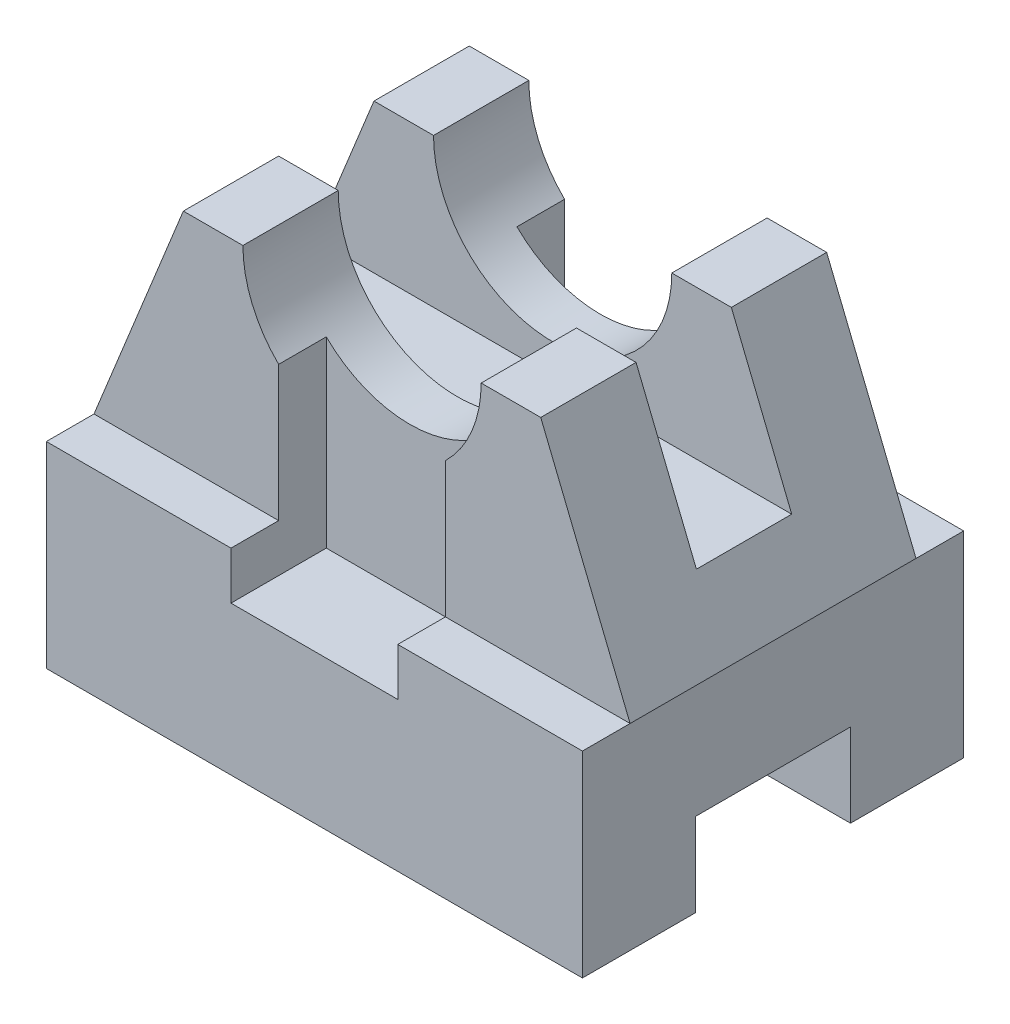
ISO-10303-21;
HEADER;
FILE_DESCRIPTION(('STEP AP214'),'2;1');
FILE_NAME('part.step','',(''),(''),'','','');
FILE_SCHEMA(('AUTOMOTIVE_DESIGN { 1 0 10303 214 1 1 1 1 }'));
ENDSEC;
DATA;
#1=APPLICATION_CONTEXT('core data for automotive mechanical design processes');
#2=APPLICATION_PROTOCOL_DEFINITION('international standard','automotive_design',2000,#1);
#3=PRODUCT_CONTEXT('',#1,'mechanical');
#4=PRODUCT('Part','Part','',(#3));
#5=PRODUCT_RELATED_PRODUCT_CATEGORY('part','',(#4));
#6=PRODUCT_DEFINITION_FORMATION('','',#4);
#7=PRODUCT_DEFINITION_CONTEXT('part definition',#1,'design');
#8=PRODUCT_DEFINITION('design','',#6,#7);
#9=PRODUCT_DEFINITION_SHAPE('','',#8);
#10=(LENGTH_UNIT() NAMED_UNIT(*) SI_UNIT(.MILLI.,.METRE.));
#11=(NAMED_UNIT(*) PLANE_ANGLE_UNIT() SI_UNIT($,.RADIAN.));
#12=(NAMED_UNIT(*) SI_UNIT($,.STERADIAN.) SOLID_ANGLE_UNIT());
#13=UNCERTAINTY_MEASURE_WITH_UNIT(LENGTH_MEASURE(1.E-05),#10,'distance_accuracy_value','');
#14=(GEOMETRIC_REPRESENTATION_CONTEXT(3) GLOBAL_UNCERTAINTY_ASSIGNED_CONTEXT((#13)) GLOBAL_UNIT_ASSIGNED_CONTEXT((#10,
#11,#12)) REPRESENTATION_CONTEXT('',''));
#15=CARTESIAN_POINT('',(0.,0.,0.));
#16=DIRECTION('',(0.,0.,1.));
#17=DIRECTION('',(1.,0.,0.));
#18=AXIS2_PLACEMENT_3D('',#15,#16,#17);
#19=CARTESIAN_POINT('',(0.,0.,0.));
#20=DIRECTION('',(0.,1.,0.));
#21=DIRECTION('',(0.,0.,1.));
#22=AXIS2_PLACEMENT_3D('',#19,#20,#21);
#23=PLANE('',#22);
#24=DIRECTION('',(0.,0.,-1.));
#25=VECTOR('',#24,1.);
#26=CARTESIAN_POINT('',(45.,0.,-32.));
#27=LINE('',#26,#25);
#28=CARTESIAN_POINT('',(45.,0.,-13.));
#29=VERTEX_POINT('',#28);
#30=CARTESIAN_POINT('',(45.,0.,-32.));
#31=VERTEX_POINT('',#30);
#32=EDGE_CURVE('E404',#29,#31,#27,.T.);
#33=ORIENTED_EDGE('',*,*,#32,.F.);
#34=DIRECTION('',(1.,0.,0.));
#35=VECTOR('',#34,1.);
#36=CARTESIAN_POINT('',(-45.,0.,-13.));
#37=LINE('',#36,#35);
#38=CARTESIAN_POINT('',(-45.,0.,-13.));
#39=VERTEX_POINT('',#38);
#40=EDGE_CURVE('E262',#39,#29,#37,.T.);
#41=ORIENTED_EDGE('',*,*,#40,.F.);
#42=DIRECTION('',(0.,0.,1.));
#43=VECTOR('',#42,1.);
#44=CARTESIAN_POINT('',(-45.,0.,-32.));
#45=LINE('',#44,#43);
#46=CARTESIAN_POINT('',(-45.,0.,-32.));
#47=VERTEX_POINT('',#46);
#48=EDGE_CURVE('E443',#47,#39,#45,.T.);
#49=ORIENTED_EDGE('',*,*,#48,.F.);
#50=DIRECTION('',(-1.,0.,0.));
#51=VECTOR('',#50,1.);
#52=CARTESIAN_POINT('',(-45.,0.,-32.));
#53=LINE('',#52,#51);
#54=EDGE_CURVE('E440',#31,#47,#53,.T.);
#55=ORIENTED_EDGE('',*,*,#54,.F.);
#56=EDGE_LOOP('',(#33,#41,#49,#55));
#57=FACE_BOUND('',#56,.T.);
#58=ADVANCED_FACE('F37',(#57),#23,.F.);
#59=CARTESIAN_POINT('',(0.,70.,-24.));
#60=DIRECTION('',(0.,0.,1.));
#61=DIRECTION('',(1.,0.,0.));
#62=AXIS2_PLACEMENT_3D('',#59,#60,#61);
#63=CYLINDRICAL_SURFACE('',#62,20.);
#64=CARTESIAN_POINT('',(0.,70.,16.));
#65=DIRECTION('',(0.,0.,1.));
#66=DIRECTION('',(1.,0.,0.));
#67=AXIS2_PLACEMENT_3D('',#64,#65,#66);
#68=CIRCLE('',#67,20.);
#69=CARTESIAN_POINT('',(-14.,55.7171431429143,16.));
#70=VERTEX_POINT('',#69);
#71=CARTESIAN_POINT('',(14.,55.7171431429143,16.));
#72=VERTEX_POINT('',#71);
#73=EDGE_CURVE('E11',#70,#72,#68,.T.);
#74=ORIENTED_EDGE('',*,*,#73,.T.);
#75=DIRECTION('',(0.,0.,1.));
#76=VECTOR('',#75,1.);
#77=CARTESIAN_POINT('',(14.,55.7171431429143,-24.));
#78=LINE('',#77,#76);
#79=CARTESIAN_POINT('',(14.,55.7171431429143,24.));
#80=VERTEX_POINT('',#79);
#81=EDGE_CURVE('E302',#72,#80,#78,.T.);
#82=ORIENTED_EDGE('',*,*,#81,.T.);
#83=CARTESIAN_POINT('',(0.,70.,24.));
#84=DIRECTION('',(0.,0.,-1.));
#85=DIRECTION('',(1.,0.,0.));
#86=AXIS2_PLACEMENT_3D('',#83,#84,#85);
#87=CIRCLE('',#86,20.);
#88=CARTESIAN_POINT('',(20.,70.,24.));
#89=VERTEX_POINT('',#88);
#90=EDGE_CURVE('E368',#89,#80,#87,.T.);
#91=ORIENTED_EDGE('',*,*,#90,.F.);
#92=DIRECTION('',(0.,0.,1.));
#93=VECTOR('',#92,1.);
#94=CARTESIAN_POINT('',(20.,70.,-24.));
#95=LINE('',#94,#93);
#96=CARTESIAN_POINT('',(20.,70.,8.));
#97=VERTEX_POINT('',#96);
#98=EDGE_CURVE('E418',#97,#89,#95,.T.);
#99=ORIENTED_EDGE('',*,*,#98,.F.);
#100=CARTESIAN_POINT('',(0.,70.,8.));
#101=DIRECTION('',(0.,0.,1.));
#102=DIRECTION('',(1.,0.,0.));
#103=AXIS2_PLACEMENT_3D('',#100,#101,#102);
#104=CIRCLE('',#103,20.);
#105=CARTESIAN_POINT('',(-20.,70.,8.));
#106=VERTEX_POINT('',#105);
#107=EDGE_CURVE('E352',#106,#97,#104,.T.);
#108=ORIENTED_EDGE('',*,*,#107,.F.);
#109=DIRECTION('',(0.,0.,1.));
#110=VECTOR('',#109,1.);
#111=CARTESIAN_POINT('',(-20.,70.,-24.));
#112=LINE('',#111,#110);
#113=CARTESIAN_POINT('',(-20.,70.,24.));
#114=VERTEX_POINT('',#113);
#115=EDGE_CURVE('E414',#106,#114,#112,.T.);
#116=ORIENTED_EDGE('',*,*,#115,.T.);
#117=CARTESIAN_POINT('',(-14.,55.7171431429143,24.));
#118=VERTEX_POINT('',#117);
#119=EDGE_CURVE('E367',#118,#114,#87,.T.);
#120=ORIENTED_EDGE('',*,*,#119,.F.);
#121=DIRECTION('',(0.,0.,1.));
#122=VECTOR('',#121,1.);
#123=CARTESIAN_POINT('',(-14.,55.7171431429143,-24.));
#124=LINE('',#123,#122);
#125=EDGE_CURVE('E60',#118,#70,#124,.F.);
#126=ORIENTED_EDGE('',*,*,#125,.T.);
#127=EDGE_LOOP('',(#74,#82,#91,#99,#108,#116,#120,#126));
#128=FACE_BOUND('',#127,.T.);
#129=ADVANCED_FACE('F498',(#128),#63,.F.);
#130=CARTESIAN_POINT('',(-45.,33.,32.));
#131=DIRECTION('',(0.,0.,-1.));
#132=DIRECTION('',(-1.,0.,0.));
#133=AXIS2_PLACEMENT_3D('',#130,#131,#132);
#134=PLANE('',#133);
#135=DIRECTION('',(0.,1.,0.));
#136=VECTOR('',#135,1.);
#137=CARTESIAN_POINT('',(14.,25.,32.));
#138=LINE('',#137,#136);
#139=CARTESIAN_POINT('',(14.,25.,32.));
#140=VERTEX_POINT('',#139);
#141=CARTESIAN_POINT('',(14.,33.,32.));
#142=VERTEX_POINT('',#141);
#143=EDGE_CURVE('E286',#140,#142,#138,.T.);
#144=ORIENTED_EDGE('',*,*,#143,.F.);
#145=DIRECTION('',(-1.,0.,0.));
#146=VECTOR('',#145,1.);
#147=CARTESIAN_POINT('',(-14.,25.,32.));
#148=LINE('',#147,#146);
#149=CARTESIAN_POINT('',(-14.,25.,32.));
#150=VERTEX_POINT('',#149);
#151=EDGE_CURVE('E282',#140,#150,#148,.T.);
#152=ORIENTED_EDGE('',*,*,#151,.T.);
#153=DIRECTION('',(0.,1.,0.));
#154=VECTOR('',#153,1.);
#155=CARTESIAN_POINT('',(-14.,25.,32.));
#156=LINE('',#155,#154);
#157=CARTESIAN_POINT('',(-14.,33.,32.));
#158=VERTEX_POINT('',#157);
#159=EDGE_CURVE('E289',#150,#158,#156,.T.);
#160=ORIENTED_EDGE('',*,*,#159,.T.);
#161=DIRECTION('',(1.,0.,0.));
#162=VECTOR('',#161,1.);
#163=CARTESIAN_POINT('',(-45.,33.,32.));
#164=LINE('',#163,#162);
#165=CARTESIAN_POINT('',(-45.,33.,32.));
#166=VERTEX_POINT('',#165);
#167=EDGE_CURVE('E435',#166,#158,#164,.T.);
#168=ORIENTED_EDGE('',*,*,#167,.F.);
#169=DIRECTION('',(0.,-1.,0.));
#170=VECTOR('',#169,1.);
#171=CARTESIAN_POINT('',(-45.,33.,32.));
#172=LINE('',#171,#170);
#173=CARTESIAN_POINT('',(-45.,0.,32.));
#174=VERTEX_POINT('',#173);
#175=EDGE_CURVE('E449',#166,#174,#172,.T.);
#176=ORIENTED_EDGE('',*,*,#175,.T.);
#177=DIRECTION('',(1.,0.,0.));
#178=VECTOR('',#177,1.);
#179=CARTESIAN_POINT('',(-45.,0.,32.));
#180=LINE('',#179,#178);
#181=CARTESIAN_POINT('',(45.,0.,32.));
#182=VERTEX_POINT('',#181);
#183=EDGE_CURVE('E446',#174,#182,#180,.T.);
#184=ORIENTED_EDGE('',*,*,#183,.T.);
#185=DIRECTION('',(0.,-1.,0.));
#186=VECTOR('',#185,1.);
#187=CARTESIAN_POINT('',(45.,33.,32.));
#188=LINE('',#187,#186);
#189=CARTESIAN_POINT('',(45.,33.,32.));
#190=VERTEX_POINT('',#189);
#191=EDGE_CURVE('E438',#190,#182,#188,.T.);
#192=ORIENTED_EDGE('',*,*,#191,.F.);
#193=EDGE_CURVE('E434',#142,#190,#164,.T.);
#194=ORIENTED_EDGE('',*,*,#193,.F.);
#195=EDGE_LOOP('',(#144,#152,#160,#168,#176,#184,#192,#194));
#196=FACE_BOUND('',#195,.T.);
#197=ADVANCED_FACE('F512',(#196),#134,.F.);
#198=CARTESIAN_POINT('',(0.,33.,0.));
#199=DIRECTION('',(0.,1.,0.));
#200=DIRECTION('',(0.,0.,1.));
#201=AXIS2_PLACEMENT_3D('',#198,#199,#200);
#202=PLANE('',#201);
#203=DIRECTION('',(1.,0.,0.));
#204=VECTOR('',#203,1.);
#205=CARTESIAN_POINT('',(45.,33.,24.));
#206=LINE('',#205,#204);
#207=CARTESIAN_POINT('',(14.,33.,24.));
#208=VERTEX_POINT('',#207);
#209=CARTESIAN_POINT('',(45.,33.,24.));
#210=VERTEX_POINT('',#209);
#211=EDGE_CURVE('E377',#208,#210,#206,.T.);
#212=ORIENTED_EDGE('',*,*,#211,.F.);
#213=DIRECTION('',(0.,0.,1.));
#214=VECTOR('',#213,1.);
#215=CARTESIAN_POINT('',(14.,33.,0.));
#216=LINE('',#215,#214);
#217=EDGE_CURVE('E299',#208,#142,#216,.T.);
#218=ORIENTED_EDGE('',*,*,#217,.T.);
#219=ORIENTED_EDGE('',*,*,#193,.T.);
#220=DIRECTION('',(0.,0.,-1.));
#221=VECTOR('',#220,1.);
#222=CARTESIAN_POINT('',(45.,33.,-32.));
#223=LINE('',#222,#221);
#224=EDGE_CURVE('E422',#190,#210,#223,.T.);
#225=ORIENTED_EDGE('',*,*,#224,.T.);
#226=EDGE_LOOP('',(#212,#218,#219,#225));
#227=FACE_BOUND('',#226,.T.);
#228=ADVANCED_FACE('F482',(#227),#202,.T.);
#229=ORIENTED_EDGE('',*,*,#167,.T.);
#230=DIRECTION('',(0.,0.,-1.));
#231=VECTOR('',#230,1.);
#232=CARTESIAN_POINT('',(-14.,33.,0.));
#233=LINE('',#232,#231);
#234=CARTESIAN_POINT('',(-14.,33.,24.));
#235=VERTEX_POINT('',#234);
#236=EDGE_CURVE('E288',#158,#235,#233,.T.);
#237=ORIENTED_EDGE('',*,*,#236,.T.);
#238=CARTESIAN_POINT('',(-45.,33.,24.));
#239=VERTEX_POINT('',#238);
#240=EDGE_CURVE('E378',#239,#235,#206,.T.);
#241=ORIENTED_EDGE('',*,*,#240,.F.);
#242=DIRECTION('',(0.,0.,1.));
#243=VECTOR('',#242,1.);
#244=CARTESIAN_POINT('',(-45.,33.,-32.));
#245=LINE('',#244,#243);
#246=EDGE_CURVE('E430',#239,#166,#245,.T.);
#247=ORIENTED_EDGE('',*,*,#246,.T.);
#248=EDGE_LOOP('',(#229,#237,#241,#247));
#249=FACE_BOUND('',#248,.T.);
#250=ADVANCED_FACE('F614',(#249),#202,.T.);
#251=CARTESIAN_POINT('',(0.,70.,24.));
#252=DIRECTION('',(0.,0.,1.));
#253=DIRECTION('',(1.,0.,0.));
#254=AXIS2_PLACEMENT_3D('',#251,#252,#253);
#255=PLANE('',#254);
#256=ORIENTED_EDGE('',*,*,#90,.T.);
#257=DIRECTION('',(0.,-1.,0.));
#258=VECTOR('',#257,1.);
#259=CARTESIAN_POINT('',(14.,70.,24.));
#260=LINE('',#259,#258);
#261=EDGE_CURVE('E45',#80,#208,#260,.T.);
#262=ORIENTED_EDGE('',*,*,#261,.T.);
#263=ORIENTED_EDGE('',*,*,#211,.T.);
#264=DIRECTION('',(-0.375705108739218,0.926739268223405,0.));
#265=VECTOR('',#264,1.);
#266=CARTESIAN_POINT('',(45.,33.,24.));
#267=LINE('',#266,#265);
#268=CARTESIAN_POINT('',(30.,70.,24.));
#269=VERTEX_POINT('',#268);
#270=EDGE_CURVE('E361',#210,#269,#267,.T.);
#271=ORIENTED_EDGE('',*,*,#270,.T.);
#272=DIRECTION('',(-1.,0.,0.));
#273=VECTOR('',#272,1.);
#274=CARTESIAN_POINT('',(30.,70.,24.));
#275=LINE('',#274,#273);
#276=EDGE_CURVE('E364',#269,#89,#275,.T.);
#277=ORIENTED_EDGE('',*,*,#276,.T.);
#278=EDGE_LOOP('',(#256,#262,#263,#271,#277));
#279=FACE_BOUND('',#278,.T.);
#280=ADVANCED_FACE('F477',(#279),#255,.T.);
#281=ORIENTED_EDGE('',*,*,#240,.T.);
#282=DIRECTION('',(0.,1.,0.));
#283=VECTOR('',#282,1.);
#284=CARTESIAN_POINT('',(-14.,70.,24.));
#285=LINE('',#284,#283);
#286=EDGE_CURVE('E473',#235,#118,#285,.T.);
#287=ORIENTED_EDGE('',*,*,#286,.T.);
#288=ORIENTED_EDGE('',*,*,#119,.T.);
#289=DIRECTION('',(-1.,0.,0.));
#290=VECTOR('',#289,1.);
#291=CARTESIAN_POINT('',(-30.,70.,24.));
#292=LINE('',#291,#290);
#293=CARTESIAN_POINT('',(-30.,70.,24.));
#294=VERTEX_POINT('',#293);
#295=EDGE_CURVE('E371',#114,#294,#292,.T.);
#296=ORIENTED_EDGE('',*,*,#295,.T.);
#297=DIRECTION('',(-0.375705108739218,-0.926739268223405,0.));
#298=VECTOR('',#297,1.);
#299=CARTESIAN_POINT('',(-45.,33.,24.));
#300=LINE('',#299,#298);
#301=EDGE_CURVE('E374',#294,#239,#300,.T.);
#302=ORIENTED_EDGE('',*,*,#301,.T.);
#303=EDGE_LOOP('',(#281,#287,#288,#296,#302));
#304=FACE_BOUND('',#303,.T.);
#305=ADVANCED_FACE('F622',(#304),#255,.T.);
#306=DIRECTION('',(0.,0.,-1.));
#307=VECTOR('',#306,1.);
#308=CARTESIAN_POINT('',(14.,33.,0.));
#309=LINE('',#308,#307);
#310=CARTESIAN_POINT('',(14.,33.,-24.));
#311=VERTEX_POINT('',#310);
#312=CARTESIAN_POINT('',(14.,33.,-32.));
#313=VERTEX_POINT('',#312);
#314=EDGE_CURVE('E334',#311,#313,#309,.T.);
#315=ORIENTED_EDGE('',*,*,#314,.F.);
#316=DIRECTION('',(1.,0.,0.));
#317=VECTOR('',#316,1.);
#318=CARTESIAN_POINT('',(45.,33.,-24.));
#319=LINE('',#318,#317);
#320=CARTESIAN_POINT('',(45.,33.,-24.));
#321=VERTEX_POINT('',#320);
#322=EDGE_CURVE('E396',#311,#321,#319,.T.);
#323=ORIENTED_EDGE('',*,*,#322,.T.);
#324=CARTESIAN_POINT('',(45.,33.,-32.));
#325=VERTEX_POINT('',#324);
#326=EDGE_CURVE('E426',#321,#325,#223,.T.);
#327=ORIENTED_EDGE('',*,*,#326,.T.);
#328=DIRECTION('',(-1.,0.,0.));
#329=VECTOR('',#328,1.);
#330=CARTESIAN_POINT('',(-45.,33.,-32.));
#331=LINE('',#330,#329);
#332=EDGE_CURVE('E427',#325,#313,#331,.T.);
#333=ORIENTED_EDGE('',*,*,#332,.T.);
#334=EDGE_LOOP('',(#315,#323,#327,#333));
#335=FACE_BOUND('',#334,.T.);
#336=ADVANCED_FACE('F545',(#335),#202,.T.);
#337=CARTESIAN_POINT('',(0.,70.,-24.));
#338=DIRECTION('',(0.,0.,1.));
#339=DIRECTION('',(1.,0.,0.));
#340=AXIS2_PLACEMENT_3D('',#337,#338,#339);
#341=PLANE('',#340);
#342=ORIENTED_EDGE('',*,*,#322,.F.);
#343=DIRECTION('',(0.,1.,0.));
#344=VECTOR('',#343,1.);
#345=CARTESIAN_POINT('',(14.,70.,-24.));
#346=LINE('',#345,#344);
#347=CARTESIAN_POINT('',(14.,55.7171431429143,-24.));
#348=VERTEX_POINT('',#347);
#349=EDGE_CURVE('E468',#311,#348,#346,.T.);
#350=ORIENTED_EDGE('',*,*,#349,.T.);
#351=CARTESIAN_POINT('',(0.,70.,-24.));
#352=DIRECTION('',(0.,0.,-1.));
#353=DIRECTION('',(1.,0.,0.));
#354=AXIS2_PLACEMENT_3D('',#351,#352,#353);
#355=CIRCLE('',#354,20.);
#356=CARTESIAN_POINT('',(20.,70.,-24.));
#357=VERTEX_POINT('',#356);
#358=EDGE_CURVE('E388',#357,#348,#355,.T.);
#359=ORIENTED_EDGE('',*,*,#358,.F.);
#360=DIRECTION('',(-1.,0.,0.));
#361=VECTOR('',#360,1.);
#362=CARTESIAN_POINT('',(30.,70.,-24.));
#363=LINE('',#362,#361);
#364=CARTESIAN_POINT('',(30.,70.,-24.));
#365=VERTEX_POINT('',#364);
#366=EDGE_CURVE('E384',#365,#357,#363,.T.);
#367=ORIENTED_EDGE('',*,*,#366,.F.);
#368=DIRECTION('',(-0.375705108739218,0.926739268223405,0.));
#369=VECTOR('',#368,1.);
#370=CARTESIAN_POINT('',(45.,33.,-24.));
#371=LINE('',#370,#369);
#372=EDGE_CURVE('E381',#321,#365,#371,.T.);
#373=ORIENTED_EDGE('',*,*,#372,.F.);
#374=EDGE_LOOP('',(#342,#350,#359,#367,#373));
#375=FACE_BOUND('',#374,.T.);
#376=ADVANCED_FACE('F549',(#375),#341,.F.);
#377=CARTESIAN_POINT('',(-30.,70.,-24.));
#378=DIRECTION('',(0.,1.,0.));
#379=DIRECTION('',(0.,0.,1.));
#380=AXIS2_PLACEMENT_3D('',#377,#378,#379);
#381=PLANE('',#380);
#382=DIRECTION('',(1.,0.,0.));
#383=VECTOR('',#382,1.);
#384=CARTESIAN_POINT('',(-45.,70.,8.));
#385=LINE('',#384,#383);
#386=CARTESIAN_POINT('',(-30.,70.,8.));
#387=VERTEX_POINT('',#386);
#388=EDGE_CURVE('E341',#387,#106,#385,.T.);
#389=ORIENTED_EDGE('',*,*,#388,.F.);
#390=DIRECTION('',(0.,0.,1.));
#391=VECTOR('',#390,1.);
#392=CARTESIAN_POINT('',(-30.,70.,-24.));
#393=LINE('',#392,#391);
#394=EDGE_CURVE('E410',#387,#294,#393,.T.);
#395=ORIENTED_EDGE('',*,*,#394,.T.);
#396=ORIENTED_EDGE('',*,*,#295,.F.);
#397=ORIENTED_EDGE('',*,*,#115,.F.);
#398=EDGE_LOOP('',(#389,#395,#396,#397));
#399=FACE_BOUND('',#398,.T.);
#400=ADVANCED_FACE('F573',(#399),#381,.T.);
#401=CARTESIAN_POINT('',(30.,70.,-24.));
#402=DIRECTION('',(0.,1.,0.));
#403=DIRECTION('',(0.,0.,1.));
#404=AXIS2_PLACEMENT_3D('',#401,#402,#403);
#405=PLANE('',#404);
#406=DIRECTION('',(1.,0.,0.));
#407=VECTOR('',#406,1.);
#408=CARTESIAN_POINT('',(30.,70.,8.));
#409=LINE('',#408,#407);
#410=CARTESIAN_POINT('',(30.,70.,8.));
#411=VERTEX_POINT('',#410);
#412=EDGE_CURVE('E460',#97,#411,#409,.T.);
#413=ORIENTED_EDGE('',*,*,#412,.F.);
#414=ORIENTED_EDGE('',*,*,#98,.T.);
#415=ORIENTED_EDGE('',*,*,#276,.F.);
#416=DIRECTION('',(0.,0.,1.));
#417=VECTOR('',#416,1.);
#418=CARTESIAN_POINT('',(30.,70.,-24.));
#419=LINE('',#418,#417);
#420=EDGE_CURVE('E400',#411,#269,#419,.T.);
#421=ORIENTED_EDGE('',*,*,#420,.F.);
#422=EDGE_LOOP('',(#413,#414,#415,#421));
#423=FACE_BOUND('',#422,.T.);
#424=ADVANCED_FACE('F578',(#423),#405,.T.);
#425=DIRECTION('',(0.,0.,1.));
#426=VECTOR('',#425,1.);
#427=CARTESIAN_POINT('',(-14.,33.,0.));
#428=LINE('',#427,#426);
#429=CARTESIAN_POINT('',(-14.,33.,-32.));
#430=VERTEX_POINT('',#429);
#431=CARTESIAN_POINT('',(-14.,33.,-24.));
#432=VERTEX_POINT('',#431);
#433=EDGE_CURVE('E330',#430,#432,#428,.T.);
#434=ORIENTED_EDGE('',*,*,#433,.F.);
#435=CARTESIAN_POINT('',(-45.,33.,-32.));
#436=VERTEX_POINT('',#435);
#437=EDGE_CURVE('E425',#430,#436,#331,.T.);
#438=ORIENTED_EDGE('',*,*,#437,.T.);
#439=CARTESIAN_POINT('',(-45.,33.,-24.));
#440=VERTEX_POINT('',#439);
#441=EDGE_CURVE('E431',#436,#440,#245,.T.);
#442=ORIENTED_EDGE('',*,*,#441,.T.);
#443=EDGE_CURVE('E397',#440,#432,#319,.T.);
#444=ORIENTED_EDGE('',*,*,#443,.T.);
#445=EDGE_LOOP('',(#434,#438,#442,#444));
#446=FACE_BOUND('',#445,.T.);
#447=ADVANCED_FACE('F580',(#446),#202,.T.);
#448=CARTESIAN_POINT('',(45.,33.,-32.));
#449=DIRECTION('',(-1.,0.,0.));
#450=DIRECTION('',(0.,0.,1.));
#451=AXIS2_PLACEMENT_3D('',#448,#449,#450);
#452=PLANE('',#451);
#453=DIRECTION('',(0.,0.,1.));
#454=VECTOR('',#453,1.);
#455=CARTESIAN_POINT('',(45.,14.,13.));
#456=LINE('',#455,#454);
#457=CARTESIAN_POINT('',(45.,14.,-13.));
#458=VERTEX_POINT('',#457);
#459=CARTESIAN_POINT('',(45.,14.,13.));
#460=VERTEX_POINT('',#459);
#461=EDGE_CURVE('E253',#458,#460,#456,.T.);
#462=ORIENTED_EDGE('',*,*,#461,.F.);
#463=DIRECTION('',(0.,-1.,0.));
#464=VECTOR('',#463,1.);
#465=CARTESIAN_POINT('',(45.,14.,-13.));
#466=LINE('',#465,#464);
#467=EDGE_CURVE('E278',#458,#29,#466,.T.);
#468=ORIENTED_EDGE('',*,*,#467,.T.);
#469=ORIENTED_EDGE('',*,*,#32,.T.);
#470=DIRECTION('',(0.,-1.,0.));
#471=VECTOR('',#470,1.);
#472=CARTESIAN_POINT('',(45.,33.,-32.));
#473=LINE('',#472,#471);
#474=EDGE_CURVE('E455',#325,#31,#473,.T.);
#475=ORIENTED_EDGE('',*,*,#474,.F.);
#476=ORIENTED_EDGE('',*,*,#326,.F.);
#477=DIRECTION('',(0.,0.,1.));
#478=VECTOR('',#477,1.);
#479=CARTESIAN_POINT('',(45.,33.,-24.));
#480=LINE('',#479,#478);
#481=EDGE_CURVE('E401',#321,#210,#480,.T.);
#482=ORIENTED_EDGE('',*,*,#481,.T.);
#483=ORIENTED_EDGE('',*,*,#224,.F.);
#484=ORIENTED_EDGE('',*,*,#191,.T.);
#485=CARTESIAN_POINT('',(45.,0.,13.));
#486=VERTEX_POINT('',#485);
#487=EDGE_CURVE('E267',#182,#486,#27,.T.);
#488=ORIENTED_EDGE('',*,*,#487,.T.);
#489=DIRECTION('',(0.,-1.,0.));
#490=VECTOR('',#489,1.);
#491=CARTESIAN_POINT('',(45.,14.,13.));
#492=LINE('',#491,#490);
#493=EDGE_CURVE('E52',#460,#486,#492,.T.);
#494=ORIENTED_EDGE('',*,*,#493,.F.);
#495=EDGE_LOOP('',(#462,#468,#469,#475,#476,#482,#483,#484,#488,#494));
#496=FACE_BOUND('',#495,.T.);
#497=ADVANCED_FACE('F39',(#496),#452,.F.);
#498=CARTESIAN_POINT('',(-45.,33.,-32.));
#499=DIRECTION('',(0.,0.,1.));
#500=DIRECTION('',(1.,0.,0.));
#501=AXIS2_PLACEMENT_3D('',#498,#499,#500);
#502=PLANE('',#501);
#503=DIRECTION('',(-1.,0.,0.));
#504=VECTOR('',#503,1.);
#505=CARTESIAN_POINT('',(-14.,25.,-32.));
#506=LINE('',#505,#504);
#507=CARTESIAN_POINT('',(14.,25.,-32.));
#508=VERTEX_POINT('',#507);
#509=CARTESIAN_POINT('',(-14.,25.,-32.));
#510=VERTEX_POINT('',#509);
#511=EDGE_CURVE('E308',#508,#510,#506,.T.);
#512=ORIENTED_EDGE('',*,*,#511,.F.);
#513=DIRECTION('',(0.,1.,0.));
#514=VECTOR('',#513,1.);
#515=CARTESIAN_POINT('',(14.,25.,-32.));
#516=LINE('',#515,#514);
#517=EDGE_CURVE('E317',#508,#313,#516,.T.);
#518=ORIENTED_EDGE('',*,*,#517,.T.);
#519=ORIENTED_EDGE('',*,*,#332,.F.);
#520=ORIENTED_EDGE('',*,*,#474,.T.);
#521=ORIENTED_EDGE('',*,*,#54,.T.);
#522=DIRECTION('',(0.,-1.,0.));
#523=VECTOR('',#522,1.);
#524=CARTESIAN_POINT('',(-45.,33.,-32.));
#525=LINE('',#524,#523);
#526=EDGE_CURVE('E452',#436,#47,#525,.T.);
#527=ORIENTED_EDGE('',*,*,#526,.F.);
#528=ORIENTED_EDGE('',*,*,#437,.F.);
#529=DIRECTION('',(0.,1.,0.));
#530=VECTOR('',#529,1.);
#531=CARTESIAN_POINT('',(-14.,25.,-32.));
#532=LINE('',#531,#530);
#533=EDGE_CURVE('E325',#510,#430,#532,.T.);
#534=ORIENTED_EDGE('',*,*,#533,.F.);
#535=EDGE_LOOP('',(#512,#518,#519,#520,#521,#527,#528,#534));
#536=FACE_BOUND('',#535,.T.);
#537=ADVANCED_FACE('F540',(#536),#502,.F.);
#538=CARTESIAN_POINT('',(-45.,33.,-32.));
#539=DIRECTION('',(1.,0.,0.));
#540=DIRECTION('',(0.,0.,-1.));
#541=AXIS2_PLACEMENT_3D('',#538,#539,#540);
#542=PLANE('',#541);
#543=ORIENTED_EDGE('',*,*,#48,.T.);
#544=DIRECTION('',(0.,-1.,0.));
#545=VECTOR('',#544,1.);
#546=CARTESIAN_POINT('',(-45.,14.,-13.));
#547=LINE('',#546,#545);
#548=CARTESIAN_POINT('',(-45.,14.,-13.));
#549=VERTEX_POINT('',#548);
#550=EDGE_CURVE('E269',#549,#39,#547,.T.);
#551=ORIENTED_EDGE('',*,*,#550,.F.);
#552=DIRECTION('',(0.,0.,-1.));
#553=VECTOR('',#552,1.);
#554=CARTESIAN_POINT('',(-45.,14.,13.));
#555=LINE('',#554,#553);
#556=CARTESIAN_POINT('',(-45.,14.,13.));
#557=VERTEX_POINT('',#556);
#558=EDGE_CURVE('E252',#557,#549,#555,.T.);
#559=ORIENTED_EDGE('',*,*,#558,.F.);
#560=DIRECTION('',(0.,-1.,0.));
#561=VECTOR('',#560,1.);
#562=CARTESIAN_POINT('',(-45.,14.,13.));
#563=LINE('',#562,#561);
#564=CARTESIAN_POINT('',(-45.,0.,13.));
#565=VERTEX_POINT('',#564);
#566=EDGE_CURVE('E249',#557,#565,#563,.T.);
#567=ORIENTED_EDGE('',*,*,#566,.T.);
#568=EDGE_CURVE('E442',#565,#174,#45,.T.);
#569=ORIENTED_EDGE('',*,*,#568,.T.);
#570=ORIENTED_EDGE('',*,*,#175,.F.);
#571=ORIENTED_EDGE('',*,*,#246,.F.);
#572=DIRECTION('',(0.,0.,1.));
#573=VECTOR('',#572,1.);
#574=CARTESIAN_POINT('',(-45.,33.,-24.));
#575=LINE('',#574,#573);
#576=EDGE_CURVE('E405',#440,#239,#575,.T.);
#577=ORIENTED_EDGE('',*,*,#576,.F.);
#578=ORIENTED_EDGE('',*,*,#441,.F.);
#579=ORIENTED_EDGE('',*,*,#526,.T.);
#580=EDGE_LOOP('',(#543,#551,#559,#567,#569,#570,#571,#577,#578,#579));
#581=FACE_BOUND('',#580,.T.);
#582=ADVANCED_FACE('F533',(#581),#542,.F.);
#583=ORIENTED_EDGE('',*,*,#568,.F.);
#584=DIRECTION('',(-1.,0.,0.));
#585=VECTOR('',#584,1.);
#586=CARTESIAN_POINT('',(-45.,0.,13.));
#587=LINE('',#586,#585);
#588=EDGE_CURVE('E519',#486,#565,#587,.T.);
#589=ORIENTED_EDGE('',*,*,#588,.F.);
#590=ORIENTED_EDGE('',*,*,#487,.F.);
#591=ORIENTED_EDGE('',*,*,#183,.F.);
#592=EDGE_LOOP('',(#583,#589,#590,#591));
#593=FACE_BOUND('',#592,.T.);
#594=ADVANCED_FACE('F518',(#593),#23,.F.);
#595=CARTESIAN_POINT('',(45.,33.,-24.));
#596=DIRECTION('',(0.926739268223405,0.375705108739218,0.));
#597=DIRECTION('',(-0.375705108739218,0.926739268223405,0.));
#598=AXIS2_PLACEMENT_3D('',#595,#596,#597);
#599=PLANE('',#598);
#600=DIRECTION('',(0.375705108739218,-0.926739268223405,0.));
#601=VECTOR('',#600,1.);
#602=CARTESIAN_POINT('',(45.,33.,8.));
#603=LINE('',#602,#601);
#604=CARTESIAN_POINT('',(40.1351351351351,45.,8.));
#605=VERTEX_POINT('',#604);
#606=EDGE_CURVE('E356',#411,#605,#603,.T.);
#607=ORIENTED_EDGE('',*,*,#606,.F.);
#608=ORIENTED_EDGE('',*,*,#420,.T.);
#609=ORIENTED_EDGE('',*,*,#270,.F.);
#610=ORIENTED_EDGE('',*,*,#481,.F.);
#611=ORIENTED_EDGE('',*,*,#372,.T.);
#612=CARTESIAN_POINT('',(30.,70.,-8.));
#613=VERTEX_POINT('',#612);
#614=EDGE_CURVE('E419',#365,#613,#419,.T.);
#615=ORIENTED_EDGE('',*,*,#614,.T.);
#616=DIRECTION('',(-0.375705108739218,0.926739268223405,0.));
#617=VECTOR('',#616,1.);
#618=CARTESIAN_POINT('',(45.,33.,-8.));
#619=LINE('',#618,#617);
#620=CARTESIAN_POINT('',(40.1351351351351,45.,-8.));
#621=VERTEX_POINT('',#620);
#622=EDGE_CURVE('E350',#621,#613,#619,.T.);
#623=ORIENTED_EDGE('',*,*,#622,.F.);
#624=DIRECTION('',(0.,0.,1.));
#625=VECTOR('',#624,1.);
#626=CARTESIAN_POINT('',(40.1351351351351,45.,-24.));
#627=LINE('',#626,#625);
#628=EDGE_CURVE('E358',#621,#605,#627,.T.);
#629=ORIENTED_EDGE('',*,*,#628,.T.);
#630=EDGE_LOOP('',(#607,#608,#609,#610,#611,#615,#623,#629));
#631=FACE_BOUND('',#630,.T.);
#632=ADVANCED_FACE('F491',(#631),#599,.T.);
#633=CARTESIAN_POINT('',(-45.,33.,-24.));
#634=DIRECTION('',(-0.926739268223405,0.375705108739218,0.));
#635=DIRECTION('',(-0.375705108739218,-0.926739268223405,0.));
#636=AXIS2_PLACEMENT_3D('',#633,#634,#635);
#637=PLANE('',#636);
#638=DIRECTION('',(0.375705108739218,0.926739268223405,0.));
#639=VECTOR('',#638,1.);
#640=CARTESIAN_POINT('',(-45.,33.,8.));
#641=LINE('',#640,#639);
#642=CARTESIAN_POINT('',(-40.1351351351351,45.,8.));
#643=VERTEX_POINT('',#642);
#644=EDGE_CURVE('E354',#643,#387,#641,.T.);
#645=ORIENTED_EDGE('',*,*,#644,.F.);
#646=DIRECTION('',(0.,0.,-1.));
#647=VECTOR('',#646,1.);
#648=CARTESIAN_POINT('',(-40.1351351351351,45.,-24.));
#649=LINE('',#648,#647);
#650=CARTESIAN_POINT('',(-40.1351351351351,45.,-8.));
#651=VERTEX_POINT('',#650);
#652=EDGE_CURVE('E462',#643,#651,#649,.T.);
#653=ORIENTED_EDGE('',*,*,#652,.T.);
#654=DIRECTION('',(-0.375705108739218,-0.926739268223405,0.));
#655=VECTOR('',#654,1.);
#656=CARTESIAN_POINT('',(-45.,33.,-8.));
#657=LINE('',#656,#655);
#658=CARTESIAN_POINT('',(-30.,70.,-8.));
#659=VERTEX_POINT('',#658);
#660=EDGE_CURVE('E348',#659,#651,#657,.T.);
#661=ORIENTED_EDGE('',*,*,#660,.F.);
#662=CARTESIAN_POINT('',(-30.,70.,-24.));
#663=VERTEX_POINT('',#662);
#664=EDGE_CURVE('E407',#663,#659,#393,.T.);
#665=ORIENTED_EDGE('',*,*,#664,.F.);
#666=DIRECTION('',(-0.375705108739218,-0.926739268223405,0.));
#667=VECTOR('',#666,1.);
#668=CARTESIAN_POINT('',(-45.,33.,-24.));
#669=LINE('',#668,#667);
#670=EDGE_CURVE('E394',#663,#440,#669,.T.);
#671=ORIENTED_EDGE('',*,*,#670,.T.);
#672=ORIENTED_EDGE('',*,*,#576,.T.);
#673=ORIENTED_EDGE('',*,*,#301,.F.);
#674=ORIENTED_EDGE('',*,*,#394,.F.);
#675=EDGE_LOOP('',(#645,#653,#661,#665,#671,#672,#673,#674));
#676=FACE_BOUND('',#675,.T.);
#677=ADVANCED_FACE('F565',(#676),#637,.T.);
#678=DIRECTION('',(-1.,0.,0.));
#679=VECTOR('',#678,1.);
#680=CARTESIAN_POINT('',(-45.,70.,-8.));
#681=LINE('',#680,#679);
#682=CARTESIAN_POINT('',(-20.,70.,-8.));
#683=VERTEX_POINT('',#682);
#684=EDGE_CURVE('E336',#683,#659,#681,.T.);
#685=ORIENTED_EDGE('',*,*,#684,.F.);
#686=CARTESIAN_POINT('',(-20.,70.,-24.));
#687=VERTEX_POINT('',#686);
#688=EDGE_CURVE('E411',#687,#683,#112,.T.);
#689=ORIENTED_EDGE('',*,*,#688,.F.);
#690=DIRECTION('',(-1.,0.,0.));
#691=VECTOR('',#690,1.);
#692=CARTESIAN_POINT('',(-30.,70.,-24.));
#693=LINE('',#692,#691);
#694=EDGE_CURVE('E391',#687,#663,#693,.T.);
#695=ORIENTED_EDGE('',*,*,#694,.T.);
#696=ORIENTED_EDGE('',*,*,#664,.T.);
#697=EDGE_LOOP('',(#685,#689,#695,#696));
#698=FACE_BOUND('',#697,.T.);
#699=ADVANCED_FACE('F589',(#698),#381,.T.);
#700=DIRECTION('',(0.,0.,1.));
#701=VECTOR('',#700,1.);
#702=CARTESIAN_POINT('',(14.,55.7171431429143,-24.));
#703=LINE('',#702,#701);
#704=CARTESIAN_POINT('',(14.,55.7171431429143,-16.));
#705=VERTEX_POINT('',#704);
#706=EDGE_CURVE('E332',#705,#348,#703,.F.);
#707=ORIENTED_EDGE('',*,*,#706,.F.);
#708=CARTESIAN_POINT('',(0.,70.,-16.));
#709=DIRECTION('',(0.,0.,1.));
#710=DIRECTION('',(1.,0.,0.));
#711=AXIS2_PLACEMENT_3D('',#708,#709,#710);
#712=CIRCLE('',#711,20.);
#713=CARTESIAN_POINT('',(-14.,55.7171431429143,-16.));
#714=VERTEX_POINT('',#713);
#715=EDGE_CURVE('E471',#714,#705,#712,.T.);
#716=ORIENTED_EDGE('',*,*,#715,.F.);
#717=DIRECTION('',(0.,0.,1.));
#718=VECTOR('',#717,1.);
#719=CARTESIAN_POINT('',(-14.,55.7171431429143,-24.));
#720=LINE('',#719,#718);
#721=CARTESIAN_POINT('',(-14.,55.7171431429143,-24.));
#722=VERTEX_POINT('',#721);
#723=EDGE_CURVE('E321',#722,#714,#720,.T.);
#724=ORIENTED_EDGE('',*,*,#723,.F.);
#725=EDGE_CURVE('E387',#722,#687,#355,.T.);
#726=ORIENTED_EDGE('',*,*,#725,.T.);
#727=ORIENTED_EDGE('',*,*,#688,.T.);
#728=CARTESIAN_POINT('',(0.,70.,-8.));
#729=DIRECTION('',(0.,0.,-1.));
#730=DIRECTION('',(-1.,0.,0.));
#731=AXIS2_PLACEMENT_3D('',#728,#729,#730);
#732=CIRCLE('',#731,20.);
#733=CARTESIAN_POINT('',(20.,70.,-8.));
#734=VERTEX_POINT('',#733);
#735=EDGE_CURVE('E344',#734,#683,#732,.T.);
#736=ORIENTED_EDGE('',*,*,#735,.F.);
#737=EDGE_CURVE('E415',#357,#734,#95,.T.);
#738=ORIENTED_EDGE('',*,*,#737,.F.);
#739=ORIENTED_EDGE('',*,*,#358,.T.);
#740=EDGE_LOOP('',(#707,#716,#724,#726,#727,#736,#738,#739));
#741=FACE_BOUND('',#740,.T.);
#742=ADVANCED_FACE('F594',(#741),#63,.F.);
#743=DIRECTION('',(-1.,0.,0.));
#744=VECTOR('',#743,1.);
#745=CARTESIAN_POINT('',(30.,70.,-8.));
#746=LINE('',#745,#744);
#747=EDGE_CURVE('E458',#613,#734,#746,.T.);
#748=ORIENTED_EDGE('',*,*,#747,.F.);
#749=ORIENTED_EDGE('',*,*,#614,.F.);
#750=ORIENTED_EDGE('',*,*,#366,.T.);
#751=ORIENTED_EDGE('',*,*,#737,.T.);
#752=EDGE_LOOP('',(#748,#749,#750,#751));
#753=FACE_BOUND('',#752,.T.);
#754=ADVANCED_FACE('F553',(#753),#405,.T.);
#755=ORIENTED_EDGE('',*,*,#725,.F.);
#756=DIRECTION('',(0.,-1.,0.));
#757=VECTOR('',#756,1.);
#758=CARTESIAN_POINT('',(-14.,70.,-24.));
#759=LINE('',#758,#757);
#760=EDGE_CURVE('E465',#722,#432,#759,.T.);
#761=ORIENTED_EDGE('',*,*,#760,.T.);
#762=ORIENTED_EDGE('',*,*,#443,.F.);
#763=ORIENTED_EDGE('',*,*,#670,.F.);
#764=ORIENTED_EDGE('',*,*,#694,.F.);
#765=EDGE_LOOP('',(#755,#761,#762,#763,#764));
#766=FACE_BOUND('',#765,.T.);
#767=ADVANCED_FACE('F593',(#766),#341,.F.);
#768=CARTESIAN_POINT('',(-45.,45.,8.));
#769=DIRECTION('',(0.,0.,1.));
#770=DIRECTION('',(1.,0.,0.));
#771=AXIS2_PLACEMENT_3D('',#768,#769,#770);
#772=PLANE('',#771);
#773=ORIENTED_EDGE('',*,*,#606,.T.);
#774=DIRECTION('',(1.,0.,0.));
#775=VECTOR('',#774,1.);
#776=CARTESIAN_POINT('',(-45.,45.,8.));
#777=LINE('',#776,#775);
#778=EDGE_CURVE('E340',#643,#605,#777,.T.);
#779=ORIENTED_EDGE('',*,*,#778,.F.);
#780=ORIENTED_EDGE('',*,*,#644,.T.);
#781=ORIENTED_EDGE('',*,*,#388,.T.);
#782=ORIENTED_EDGE('',*,*,#107,.T.);
#783=ORIENTED_EDGE('',*,*,#412,.T.);
#784=EDGE_LOOP('',(#773,#779,#780,#781,#782,#783));
#785=FACE_BOUND('',#784,.T.);
#786=ADVANCED_FACE('F570',(#785),#772,.F.);
#787=CARTESIAN_POINT('',(-45.,45.,-8.));
#788=DIRECTION('',(0.,0.,-1.));
#789=DIRECTION('',(-1.,0.,0.));
#790=AXIS2_PLACEMENT_3D('',#787,#788,#789);
#791=PLANE('',#790);
#792=ORIENTED_EDGE('',*,*,#622,.T.);
#793=ORIENTED_EDGE('',*,*,#747,.T.);
#794=ORIENTED_EDGE('',*,*,#735,.T.);
#795=ORIENTED_EDGE('',*,*,#684,.T.);
#796=ORIENTED_EDGE('',*,*,#660,.T.);
#797=DIRECTION('',(-1.,0.,0.));
#798=VECTOR('',#797,1.);
#799=CARTESIAN_POINT('',(-45.,45.,-8.));
#800=LINE('',#799,#798);
#801=EDGE_CURVE('E337',#621,#651,#800,.T.);
#802=ORIENTED_EDGE('',*,*,#801,.F.);
#803=EDGE_LOOP('',(#792,#793,#794,#795,#796,#802));
#804=FACE_BOUND('',#803,.T.);
#805=ADVANCED_FACE('F557',(#804),#791,.F.);
#806=CARTESIAN_POINT('',(0.,45.,0.));
#807=DIRECTION('',(0.,1.,0.));
#808=DIRECTION('',(0.,0.,1.));
#809=AXIS2_PLACEMENT_3D('',#806,#807,#808);
#810=PLANE('',#809);
#811=ORIENTED_EDGE('',*,*,#801,.T.);
#812=ORIENTED_EDGE('',*,*,#652,.F.);
#813=ORIENTED_EDGE('',*,*,#778,.T.);
#814=ORIENTED_EDGE('',*,*,#628,.F.);
#815=EDGE_LOOP('',(#811,#812,#813,#814));
#816=FACE_BOUND('',#815,.T.);
#817=ADVANCED_FACE('F561',(#816),#810,.T.);
#818=CARTESIAN_POINT('',(14.,25.,-32.));
#819=DIRECTION('',(1.,0.,0.));
#820=DIRECTION('',(0.,0.,-1.));
#821=AXIS2_PLACEMENT_3D('',#818,#819,#820);
#822=PLANE('',#821);
#823=ORIENTED_EDGE('',*,*,#314,.T.);
#824=ORIENTED_EDGE('',*,*,#517,.F.);
#825=DIRECTION('',(0.,0.,-1.));
#826=VECTOR('',#825,1.);
#827=CARTESIAN_POINT('',(14.,25.,-32.));
#828=LINE('',#827,#826);
#829=CARTESIAN_POINT('',(14.,25.,-16.));
#830=VERTEX_POINT('',#829);
#831=EDGE_CURVE('E305',#830,#508,#828,.T.);
#832=ORIENTED_EDGE('',*,*,#831,.F.);
#833=DIRECTION('',(0.,1.,0.));
#834=VECTOR('',#833,1.);
#835=CARTESIAN_POINT('',(14.,25.,-16.));
#836=LINE('',#835,#834);
#837=EDGE_CURVE('E318',#830,#705,#836,.T.);
#838=ORIENTED_EDGE('',*,*,#837,.T.);
#839=ORIENTED_EDGE('',*,*,#706,.T.);
#840=ORIENTED_EDGE('',*,*,#349,.F.);
#841=EDGE_LOOP('',(#823,#824,#832,#838,#839,#840));
#842=FACE_BOUND('',#841,.T.);
#843=ADVANCED_FACE('F649',(#842),#822,.F.);
#844=CARTESIAN_POINT('',(-14.,25.,-16.));
#845=DIRECTION('',(0.,0.,1.));
#846=DIRECTION('',(1.,0.,0.));
#847=AXIS2_PLACEMENT_3D('',#844,#845,#846);
#848=PLANE('',#847);
#849=ORIENTED_EDGE('',*,*,#715,.T.);
#850=ORIENTED_EDGE('',*,*,#837,.F.);
#851=DIRECTION('',(1.,0.,0.));
#852=VECTOR('',#851,1.);
#853=CARTESIAN_POINT('',(-14.,25.,-16.));
#854=LINE('',#853,#852);
#855=CARTESIAN_POINT('',(-14.,25.,-16.));
#856=VERTEX_POINT('',#855);
#857=EDGE_CURVE('E314',#856,#830,#854,.T.);
#858=ORIENTED_EDGE('',*,*,#857,.F.);
#859=DIRECTION('',(0.,1.,0.));
#860=VECTOR('',#859,1.);
#861=CARTESIAN_POINT('',(-14.,25.,-16.));
#862=LINE('',#861,#860);
#863=EDGE_CURVE('E322',#856,#714,#862,.T.);
#864=ORIENTED_EDGE('',*,*,#863,.T.);
#865=EDGE_LOOP('',(#849,#850,#858,#864));
#866=FACE_BOUND('',#865,.T.);
#867=ADVANCED_FACE('F653',(#866),#848,.F.);
#868=CARTESIAN_POINT('',(-14.,25.,-32.));
#869=DIRECTION('',(-1.,0.,0.));
#870=DIRECTION('',(0.,0.,1.));
#871=AXIS2_PLACEMENT_3D('',#868,#869,#870);
#872=PLANE('',#871);
#873=ORIENTED_EDGE('',*,*,#433,.T.);
#874=ORIENTED_EDGE('',*,*,#760,.F.);
#875=ORIENTED_EDGE('',*,*,#723,.T.);
#876=ORIENTED_EDGE('',*,*,#863,.F.);
#877=DIRECTION('',(0.,0.,1.));
#878=VECTOR('',#877,1.);
#879=CARTESIAN_POINT('',(-14.,25.,-32.));
#880=LINE('',#879,#878);
#881=EDGE_CURVE('E311',#510,#856,#880,.T.);
#882=ORIENTED_EDGE('',*,*,#881,.F.);
#883=ORIENTED_EDGE('',*,*,#533,.T.);
#884=EDGE_LOOP('',(#873,#874,#875,#876,#882,#883));
#885=FACE_BOUND('',#884,.T.);
#886=ADVANCED_FACE('F655',(#885),#872,.F.);
#887=CARTESIAN_POINT('',(0.,25.,0.));
#888=DIRECTION('',(0.,1.,0.));
#889=DIRECTION('',(0.,0.,1.));
#890=AXIS2_PLACEMENT_3D('',#887,#888,#889);
#891=PLANE('',#890);
#892=ORIENTED_EDGE('',*,*,#831,.T.);
#893=ORIENTED_EDGE('',*,*,#511,.T.);
#894=ORIENTED_EDGE('',*,*,#881,.T.);
#895=ORIENTED_EDGE('',*,*,#857,.T.);
#896=EDGE_LOOP('',(#892,#893,#894,#895));
#897=FACE_BOUND('',#896,.T.);
#898=ADVANCED_FACE('F657',(#897),#891,.T.);
#899=CARTESIAN_POINT('',(14.,25.,32.));
#900=DIRECTION('',(-1.,0.,0.));
#901=DIRECTION('',(0.,0.,1.));
#902=AXIS2_PLACEMENT_3D('',#899,#900,#901);
#903=PLANE('',#902);
#904=DIRECTION('',(0.,1.,0.));
#905=VECTOR('',#904,1.);
#906=CARTESIAN_POINT('',(14.,25.,16.));
#907=LINE('',#906,#905);
#908=CARTESIAN_POINT('',(14.,25.,16.));
#909=VERTEX_POINT('',#908);
#910=EDGE_CURVE('E285',#909,#72,#907,.T.);
#911=ORIENTED_EDGE('',*,*,#910,.F.);
#912=DIRECTION('',(0.,0.,1.));
#913=VECTOR('',#912,1.);
#914=CARTESIAN_POINT('',(14.,25.,32.));
#915=LINE('',#914,#913);
#916=EDGE_CURVE('E274',#909,#140,#915,.T.);
#917=ORIENTED_EDGE('',*,*,#916,.T.);
#918=ORIENTED_EDGE('',*,*,#143,.T.);
#919=ORIENTED_EDGE('',*,*,#217,.F.);
#920=ORIENTED_EDGE('',*,*,#261,.F.);
#921=ORIENTED_EDGE('',*,*,#81,.F.);
#922=EDGE_LOOP('',(#911,#917,#918,#919,#920,#921));
#923=FACE_BOUND('',#922,.T.);
#924=ADVANCED_FACE('F501',(#923),#903,.T.);
#925=CARTESIAN_POINT('',(-14.,25.,32.));
#926=DIRECTION('',(1.,0.,0.));
#927=DIRECTION('',(0.,0.,-1.));
#928=AXIS2_PLACEMENT_3D('',#925,#926,#927);
#929=PLANE('',#928);
#930=ORIENTED_EDGE('',*,*,#286,.F.);
#931=ORIENTED_EDGE('',*,*,#236,.F.);
#932=ORIENTED_EDGE('',*,*,#159,.F.);
#933=DIRECTION('',(0.,0.,-1.));
#934=VECTOR('',#933,1.);
#935=CARTESIAN_POINT('',(-14.,25.,32.));
#936=LINE('',#935,#934);
#937=CARTESIAN_POINT('',(-14.,25.,16.));
#938=VERTEX_POINT('',#937);
#939=EDGE_CURVE('E280',#150,#938,#936,.T.);
#940=ORIENTED_EDGE('',*,*,#939,.T.);
#941=DIRECTION('',(0.,1.,0.));
#942=VECTOR('',#941,1.);
#943=CARTESIAN_POINT('',(-14.,25.,16.));
#944=LINE('',#943,#942);
#945=EDGE_CURVE('E292',#938,#70,#944,.T.);
#946=ORIENTED_EDGE('',*,*,#945,.T.);
#947=ORIENTED_EDGE('',*,*,#125,.F.);
#948=EDGE_LOOP('',(#930,#931,#932,#940,#946,#947));
#949=FACE_BOUND('',#948,.T.);
#950=ADVANCED_FACE('F665',(#949),#929,.T.);
#951=CARTESIAN_POINT('',(-14.,25.,16.));
#952=DIRECTION('',(0.,0.,1.));
#953=DIRECTION('',(1.,0.,0.));
#954=AXIS2_PLACEMENT_3D('',#951,#952,#953);
#955=PLANE('',#954);
#956=ORIENTED_EDGE('',*,*,#945,.F.);
#957=DIRECTION('',(1.,0.,0.));
#958=VECTOR('',#957,1.);
#959=CARTESIAN_POINT('',(-14.,25.,16.));
#960=LINE('',#959,#958);
#961=EDGE_CURVE('E277',#938,#909,#960,.T.);
#962=ORIENTED_EDGE('',*,*,#961,.T.);
#963=ORIENTED_EDGE('',*,*,#910,.T.);
#964=ORIENTED_EDGE('',*,*,#73,.F.);
#965=EDGE_LOOP('',(#956,#962,#963,#964));
#966=FACE_BOUND('',#965,.T.);
#967=ADVANCED_FACE('F505',(#966),#955,.T.);
#968=CARTESIAN_POINT('',(0.,25.,0.));
#969=DIRECTION('',(0.,1.,0.));
#970=DIRECTION('',(0.,0.,-1.));
#971=AXIS2_PLACEMENT_3D('',#968,#969,#970);
#972=PLANE('',#971);
#973=ORIENTED_EDGE('',*,*,#916,.F.);
#974=ORIENTED_EDGE('',*,*,#961,.F.);
#975=ORIENTED_EDGE('',*,*,#939,.F.);
#976=ORIENTED_EDGE('',*,*,#151,.F.);
#977=EDGE_LOOP('',(#973,#974,#975,#976));
#978=FACE_BOUND('',#977,.T.);
#979=ADVANCED_FACE('F509',(#978),#972,.T.);
#980=CARTESIAN_POINT('',(-45.,14.,-13.));
#981=DIRECTION('',(0.,0.,-1.));
#982=DIRECTION('',(-1.,0.,0.));
#983=AXIS2_PLACEMENT_3D('',#980,#981,#982);
#984=PLANE('',#983);
#985=ORIENTED_EDGE('',*,*,#40,.T.);
#986=ORIENTED_EDGE('',*,*,#467,.F.);
#987=DIRECTION('',(1.,0.,0.));
#988=VECTOR('',#987,1.);
#989=CARTESIAN_POINT('',(-45.,14.,-13.));
#990=LINE('',#989,#988);
#991=EDGE_CURVE('E259',#549,#458,#990,.T.);
#992=ORIENTED_EDGE('',*,*,#991,.F.);
#993=ORIENTED_EDGE('',*,*,#550,.T.);
#994=EDGE_LOOP('',(#985,#986,#992,#993));
#995=FACE_BOUND('',#994,.T.);
#996=ADVANCED_FACE('F527',(#995),#984,.F.);
#997=CARTESIAN_POINT('',(-45.,14.,13.));
#998=DIRECTION('',(0.,0.,1.));
#999=DIRECTION('',(1.,0.,0.));
#1000=AXIS2_PLACEMENT_3D('',#997,#998,#999);
#1001=PLANE('',#1000);
#1002=ORIENTED_EDGE('',*,*,#588,.T.);
#1003=ORIENTED_EDGE('',*,*,#566,.F.);
#1004=DIRECTION('',(-1.,0.,0.));
#1005=VECTOR('',#1004,1.);
#1006=CARTESIAN_POINT('',(-45.,14.,13.));
#1007=LINE('',#1006,#1005);
#1008=EDGE_CURVE('E245',#460,#557,#1007,.T.);
#1009=ORIENTED_EDGE('',*,*,#1008,.F.);
#1010=ORIENTED_EDGE('',*,*,#493,.T.);
#1011=EDGE_LOOP('',(#1002,#1003,#1009,#1010));
#1012=FACE_BOUND('',#1011,.T.);
#1013=ADVANCED_FACE('F247',(#1012),#1001,.F.);
#1014=CARTESIAN_POINT('',(0.,14.,0.));
#1015=DIRECTION('',(0.,-1.,0.));
#1016=DIRECTION('',(0.,0.,-1.));
#1017=AXIS2_PLACEMENT_3D('',#1014,#1015,#1016);
#1018=PLANE('',#1017);
#1019=ORIENTED_EDGE('',*,*,#461,.T.);
#1020=ORIENTED_EDGE('',*,*,#1008,.T.);
#1021=ORIENTED_EDGE('',*,*,#558,.T.);
#1022=ORIENTED_EDGE('',*,*,#991,.T.);
#1023=EDGE_LOOP('',(#1019,#1020,#1021,#1022));
#1024=FACE_BOUND('',#1023,.T.);
#1025=ADVANCED_FACE('F257',(#1024),#1018,.T.);
#1026=CLOSED_SHELL('',(#58,#129,#197,#228,#250,#280,#305,#336,#376,#400,#424,#447,#497,#537,
#582,#594,#632,#677,#699,#742,#754,#767,#786,#805,#817,#843,#867,#886,#898,#924,#950,#967,#979,
#996,#1013,#1025));
#1027=MANIFOLD_SOLID_BREP('B2',#1026);
#1028=ADVANCED_BREP_SHAPE_REPRESENTATION('',(#18,#1027),#14);
#1029=SHAPE_DEFINITION_REPRESENTATION(#9,#1028);
ENDSEC;
END-ISO-10303-21;
